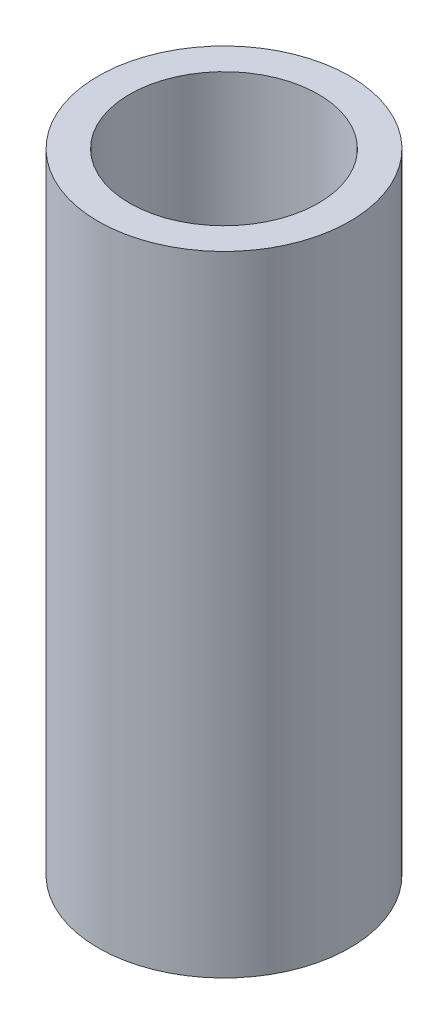
ISO-10303-21;
HEADER;
FILE_DESCRIPTION(('STEP AP214'),'2;1');
FILE_NAME('part.step','',(''),(''),'','','');
FILE_SCHEMA(('AUTOMOTIVE_DESIGN { 1 0 10303 214 1 1 1 1 }'));
ENDSEC;
DATA;
#1=APPLICATION_CONTEXT('core data for automotive mechanical design processes');
#2=APPLICATION_PROTOCOL_DEFINITION('international standard','automotive_design',2000,#1);
#3=PRODUCT_CONTEXT('',#1,'mechanical');
#4=PRODUCT('Part','Part','',(#3));
#5=PRODUCT_RELATED_PRODUCT_CATEGORY('part','',(#4));
#6=PRODUCT_DEFINITION_FORMATION('','',#4);
#7=PRODUCT_DEFINITION_CONTEXT('part definition',#1,'design');
#8=PRODUCT_DEFINITION('design','',#6,#7);
#9=PRODUCT_DEFINITION_SHAPE('','',#8);
#10=(LENGTH_UNIT() NAMED_UNIT(*) SI_UNIT(.MILLI.,.METRE.));
#11=(NAMED_UNIT(*) PLANE_ANGLE_UNIT() SI_UNIT($,.RADIAN.));
#12=(NAMED_UNIT(*) SI_UNIT($,.STERADIAN.) SOLID_ANGLE_UNIT());
#13=UNCERTAINTY_MEASURE_WITH_UNIT(LENGTH_MEASURE(1.E-05),#10,'distance_accuracy_value','');
#14=(GEOMETRIC_REPRESENTATION_CONTEXT(3) GLOBAL_UNCERTAINTY_ASSIGNED_CONTEXT((#13)) GLOBAL_UNIT_ASSIGNED_CONTEXT((#10,
#11,#12)) REPRESENTATION_CONTEXT('',''));
#15=CARTESIAN_POINT('',(0.,0.,0.));
#16=DIRECTION('',(0.,0.,1.));
#17=DIRECTION('',(1.,0.,0.));
#18=AXIS2_PLACEMENT_3D('',#15,#16,#17);
#19=CARTESIAN_POINT('',(0.,100.,0.));
#20=DIRECTION('',(0.,1.,0.));
#21=DIRECTION('',(0.,0.,1.));
#22=AXIS2_PLACEMENT_3D('',#19,#20,#21);
#23=PLANE('',#22);
#24=CARTESIAN_POINT('',(0.,100.,0.));
#25=DIRECTION('',(0.,1.,0.));
#26=DIRECTION('',(0.,0.,1.));
#27=AXIS2_PLACEMENT_3D('',#24,#25,#26);
#28=CIRCLE('',#27,20.);
#29=CARTESIAN_POINT('',(0.,100.,20.));
#30=VERTEX_POINT('',#29);
#31=EDGE_CURVE('E10',#30,#30,#28,.T.);
#32=ORIENTED_EDGE('',*,*,#31,.T.);
#33=EDGE_LOOP('',(#32));
#34=FACE_BOUND('',#33,.T.);
#35=CARTESIAN_POINT('',(0.,100.,0.));
#36=DIRECTION('',(0.,1.,0.));
#37=DIRECTION('',(0.,0.,1.));
#38=AXIS2_PLACEMENT_3D('',#35,#36,#37);
#39=CIRCLE('',#38,15.);
#40=CARTESIAN_POINT('',(0.,100.,15.));
#41=VERTEX_POINT('',#40);
#42=EDGE_CURVE('E57',#41,#41,#39,.T.);
#43=ORIENTED_EDGE('',*,*,#42,.F.);
#44=EDGE_LOOP('',(#43));
#45=FACE_BOUND('',#44,.T.);
#46=ADVANCED_FACE('F43',(#34,#45),#23,.T.);
#47=CARTESIAN_POINT('',(0.,0.,0.));
#48=DIRECTION('',(0.,1.,0.));
#49=DIRECTION('',(0.,0.,1.));
#50=AXIS2_PLACEMENT_3D('',#47,#48,#49);
#51=PLANE('',#50);
#52=CARTESIAN_POINT('',(0.,0.,0.));
#53=DIRECTION('',(0.,1.,0.));
#54=DIRECTION('',(0.,0.,1.));
#55=AXIS2_PLACEMENT_3D('',#52,#53,#54);
#56=CIRCLE('',#55,20.);
#57=CARTESIAN_POINT('',(0.,0.,20.));
#58=VERTEX_POINT('',#57);
#59=EDGE_CURVE('E50',#58,#58,#56,.T.);
#60=ORIENTED_EDGE('',*,*,#59,.F.);
#61=EDGE_LOOP('',(#60));
#62=FACE_BOUND('',#61,.T.);
#63=CARTESIAN_POINT('',(0.,0.,0.));
#64=DIRECTION('',(0.,1.,0.));
#65=DIRECTION('',(0.,0.,1.));
#66=AXIS2_PLACEMENT_3D('',#63,#64,#65);
#67=CIRCLE('',#66,15.);
#68=CARTESIAN_POINT('',(0.,0.,15.));
#69=VERTEX_POINT('',#68);
#70=EDGE_CURVE('E59',#69,#69,#67,.T.);
#71=ORIENTED_EDGE('',*,*,#70,.T.);
#72=EDGE_LOOP('',(#71));
#73=FACE_BOUND('',#72,.T.);
#74=ADVANCED_FACE('F68',(#62,#73),#51,.F.);
#75=CARTESIAN_POINT('',(0.,100.,0.));
#76=DIRECTION('',(0.,-1.,0.));
#77=DIRECTION('',(0.,0.,-1.));
#78=AXIS2_PLACEMENT_3D('',#75,#76,#77);
#79=CYLINDRICAL_SURFACE('',#78,20.);
#80=ORIENTED_EDGE('',*,*,#31,.F.);
#81=EDGE_LOOP('',(#80));
#82=FACE_BOUND('',#81,.T.);
#83=ORIENTED_EDGE('',*,*,#59,.T.);
#84=EDGE_LOOP('',(#83));
#85=FACE_BOUND('',#84,.T.);
#86=ADVANCED_FACE('F44',(#82,#85),#79,.T.);
#87=CARTESIAN_POINT('',(0.,100.,0.));
#88=DIRECTION('',(0.,-1.,0.));
#89=DIRECTION('',(0.,0.,-1.));
#90=AXIS2_PLACEMENT_3D('',#87,#88,#89);
#91=CYLINDRICAL_SURFACE('',#90,15.);
#92=ORIENTED_EDGE('',*,*,#42,.T.);
#93=EDGE_LOOP('',(#92));
#94=FACE_BOUND('',#93,.T.);
#95=ORIENTED_EDGE('',*,*,#70,.F.);
#96=EDGE_LOOP('',(#95));
#97=FACE_BOUND('',#96,.T.);
#98=ADVANCED_FACE('F67',(#94,#97),#91,.F.);
#99=CLOSED_SHELL('',(#46,#74,#86,#98));
#100=MANIFOLD_SOLID_BREP('B2',#99);
#101=ADVANCED_BREP_SHAPE_REPRESENTATION('',(#18,#100),#14);
#102=SHAPE_DEFINITION_REPRESENTATION(#9,#101);
ENDSEC;
END-ISO-10303-21;
